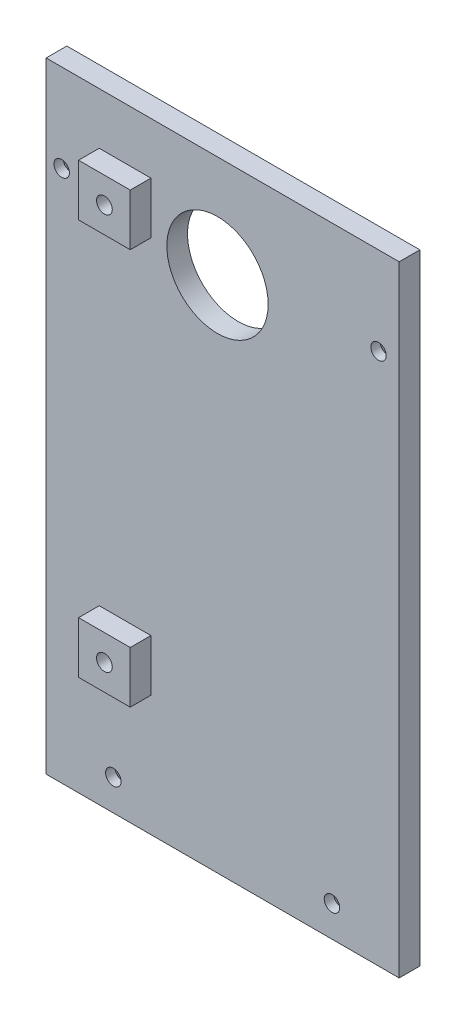
ISO-10303-21;
HEADER;
FILE_DESCRIPTION(('STEP AP214'),'2;1');
FILE_NAME('part.step','',(''),(''),'','','');
FILE_SCHEMA(('AUTOMOTIVE_DESIGN { 1 0 10303 214 1 1 1 1 }'));
ENDSEC;
DATA;
#1=APPLICATION_CONTEXT('core data for automotive mechanical design processes');
#2=APPLICATION_PROTOCOL_DEFINITION('international standard','automotive_design',2000,#1);
#3=PRODUCT_CONTEXT('',#1,'mechanical');
#4=PRODUCT('Part','Part','',(#3));
#5=PRODUCT_RELATED_PRODUCT_CATEGORY('part','',(#4));
#6=PRODUCT_DEFINITION_FORMATION('','',#4);
#7=PRODUCT_DEFINITION_CONTEXT('part definition',#1,'design');
#8=PRODUCT_DEFINITION('design','',#6,#7);
#9=PRODUCT_DEFINITION_SHAPE('','',#8);
#10=(LENGTH_UNIT() NAMED_UNIT(*) SI_UNIT(.MILLI.,.METRE.));
#11=(NAMED_UNIT(*) PLANE_ANGLE_UNIT() SI_UNIT($,.RADIAN.));
#12=(NAMED_UNIT(*) SI_UNIT($,.STERADIAN.) SOLID_ANGLE_UNIT());
#13=UNCERTAINTY_MEASURE_WITH_UNIT(LENGTH_MEASURE(1.E-05),#10,'distance_accuracy_value','');
#14=(GEOMETRIC_REPRESENTATION_CONTEXT(3) GLOBAL_UNCERTAINTY_ASSIGNED_CONTEXT((#13)) GLOBAL_UNIT_ASSIGNED_CONTEXT((#10,
#11,#12)) REPRESENTATION_CONTEXT('',''));
#15=CARTESIAN_POINT('',(0.,0.,0.));
#16=DIRECTION('',(0.,0.,1.));
#17=DIRECTION('',(1.,0.,0.));
#18=AXIS2_PLACEMENT_3D('',#15,#16,#17);
#19=CARTESIAN_POINT('',(0.,0.,2.));
#20=DIRECTION('',(0.,0.,-1.));
#21=DIRECTION('',(-1.,0.,0.));
#22=AXIS2_PLACEMENT_3D('',#19,#20,#21);
#23=PLANE('',#22);
#24=CARTESIAN_POINT('',(15.575,21.5,2.));
#25=DIRECTION('',(0.,0.,-1.));
#26=DIRECTION('',(-1.,0.,0.));
#27=AXIS2_PLACEMENT_3D('',#24,#25,#26);
#28=CIRCLE('',#27,0.75);
#29=CARTESIAN_POINT('',(14.825,21.5,2.));
#30=VERTEX_POINT('',#29);
#31=EDGE_CURVE('E180',#30,#30,#28,.F.);
#32=ORIENTED_EDGE('',*,*,#31,.F.);
#33=EDGE_LOOP('',(#32));
#34=FACE_BOUND('',#33,.T.);
#35=CARTESIAN_POINT('',(-15.075,21.5,2.));
#36=DIRECTION('',(0.,0.,-1.));
#37=DIRECTION('',(-1.,0.,0.));
#38=AXIS2_PLACEMENT_3D('',#35,#36,#37);
#39=CIRCLE('',#38,0.75);
#40=CARTESIAN_POINT('',(-15.825,21.5,2.));
#41=VERTEX_POINT('',#40);
#42=EDGE_CURVE('E184',#41,#41,#39,.F.);
#43=ORIENTED_EDGE('',*,*,#42,.F.);
#44=EDGE_LOOP('',(#43));
#45=FACE_BOUND('',#44,.T.);
#46=CARTESIAN_POINT('',(-10.075,-27.,2.));
#47=DIRECTION('',(0.,0.,-1.));
#48=DIRECTION('',(-1.,0.,0.));
#49=AXIS2_PLACEMENT_3D('',#46,#47,#48);
#50=CIRCLE('',#49,0.75);
#51=CARTESIAN_POINT('',(-10.825,-27.,2.));
#52=VERTEX_POINT('',#51);
#53=EDGE_CURVE('E187',#52,#52,#50,.F.);
#54=ORIENTED_EDGE('',*,*,#53,.F.);
#55=EDGE_LOOP('',(#54));
#56=FACE_BOUND('',#55,.T.);
#57=CARTESIAN_POINT('',(11.075,-27.,2.));
#58=DIRECTION('',(0.,0.,-1.));
#59=DIRECTION('',(-1.,0.,0.));
#60=AXIS2_PLACEMENT_3D('',#57,#58,#59);
#61=CIRCLE('',#60,0.75);
#62=CARTESIAN_POINT('',(10.325,-27.,2.));
#63=VERTEX_POINT('',#62);
#64=EDGE_CURVE('E178',#63,#63,#61,.F.);
#65=ORIENTED_EDGE('',*,*,#64,.F.);
#66=EDGE_LOOP('',(#65));
#67=FACE_BOUND('',#66,.T.);
#68=DIRECTION('',(0.,-1.,0.));
#69=VECTOR('',#68,1.);
#70=CARTESIAN_POINT('',(-11.44,25.,2.));
#71=LINE('',#70,#69);
#72=CARTESIAN_POINT('',(-11.44,25.,2.));
#73=VERTEX_POINT('',#72);
#74=CARTESIAN_POINT('',(-11.44,20.,2.));
#75=VERTEX_POINT('',#74);
#76=EDGE_CURVE('E224',#73,#75,#71,.T.);
#77=ORIENTED_EDGE('',*,*,#76,.F.);
#78=DIRECTION('',(-1.,0.,0.));
#79=VECTOR('',#78,1.);
#80=CARTESIAN_POINT('',(-11.44,25.,2.));
#81=LINE('',#80,#79);
#82=CARTESIAN_POINT('',(-6.44,25.,2.));
#83=VERTEX_POINT('',#82);
#84=EDGE_CURVE('E229',#83,#73,#81,.T.);
#85=ORIENTED_EDGE('',*,*,#84,.F.);
#86=DIRECTION('',(0.,1.,0.));
#87=VECTOR('',#86,1.);
#88=CARTESIAN_POINT('',(-6.44,25.,2.));
#89=LINE('',#88,#87);
#90=CARTESIAN_POINT('',(-6.44,20.,2.));
#91=VERTEX_POINT('',#90);
#92=EDGE_CURVE('E241',#91,#83,#89,.T.);
#93=ORIENTED_EDGE('',*,*,#92,.F.);
#94=DIRECTION('',(1.,0.,0.));
#95=VECTOR('',#94,1.);
#96=CARTESIAN_POINT('',(-11.44,20.,2.));
#97=LINE('',#96,#95);
#98=EDGE_CURVE('E238',#75,#91,#97,.T.);
#99=ORIENTED_EDGE('',*,*,#98,.F.);
#100=EDGE_LOOP('',(#77,#85,#93,#99));
#101=FACE_BOUND('',#100,.T.);
#102=DIRECTION('',(1.,0.,0.));
#103=VECTOR('',#102,1.);
#104=CARTESIAN_POINT('',(-16.575,-30.,2.));
#105=LINE('',#104,#103);
#106=CARTESIAN_POINT('',(-16.575,-30.,2.));
#107=VERTEX_POINT('',#106);
#108=CARTESIAN_POINT('',(17.575,-30.,2.));
#109=VERTEX_POINT('',#108);
#110=EDGE_CURVE('E142',#107,#109,#105,.T.);
#111=ORIENTED_EDGE('',*,*,#110,.T.);
#112=DIRECTION('',(0.,-1.,0.));
#113=VECTOR('',#112,1.);
#114=CARTESIAN_POINT('',(17.575,30.,2.));
#115=LINE('',#114,#113);
#116=CARTESIAN_POINT('',(17.575,30.,2.));
#117=VERTEX_POINT('',#116);
#118=EDGE_CURVE('E146',#117,#109,#115,.T.);
#119=ORIENTED_EDGE('',*,*,#118,.F.);
#120=DIRECTION('',(-1.,0.,0.));
#121=VECTOR('',#120,1.);
#122=CARTESIAN_POINT('',(-16.575,30.,2.));
#123=LINE('',#122,#121);
#124=CARTESIAN_POINT('',(-16.575,30.,2.));
#125=VERTEX_POINT('',#124);
#126=EDGE_CURVE('E264',#117,#125,#123,.T.);
#127=ORIENTED_EDGE('',*,*,#126,.T.);
#128=DIRECTION('',(0.,-1.,0.));
#129=VECTOR('',#128,1.);
#130=CARTESIAN_POINT('',(-16.575,-30.,2.));
#131=LINE('',#130,#129);
#132=EDGE_CURVE('E148',#125,#107,#131,.T.);
#133=ORIENTED_EDGE('',*,*,#132,.T.);
#134=EDGE_LOOP('',(#111,#119,#127,#133));
#135=FACE_BOUND('',#134,.T.);
#136=CARTESIAN_POINT('',(0.,20.1,2.));
#137=DIRECTION('',(0.,0.,1.));
#138=DIRECTION('',(1.,0.,0.));
#139=AXIS2_PLACEMENT_3D('',#136,#137,#138);
#140=CIRCLE('',#139,4.9);
#141=CARTESIAN_POINT('',(4.9,20.1,2.));
#142=VERTEX_POINT('',#141);
#143=EDGE_CURVE('E258',#142,#142,#140,.T.);
#144=ORIENTED_EDGE('',*,*,#143,.F.);
#145=EDGE_LOOP('',(#144));
#146=FACE_BOUND('',#145,.T.);
#147=DIRECTION('',(0.,-1.,0.));
#148=VECTOR('',#147,1.);
#149=CARTESIAN_POINT('',(-11.44,-18.32,2.));
#150=LINE('',#149,#148);
#151=CARTESIAN_POINT('',(-11.44,-13.32,2.));
#152=VERTEX_POINT('',#151);
#153=CARTESIAN_POINT('',(-11.44,-18.32,2.));
#154=VERTEX_POINT('',#153);
#155=EDGE_CURVE('E183',#152,#154,#150,.T.);
#156=ORIENTED_EDGE('',*,*,#155,.F.);
#157=DIRECTION('',(-1.,0.,0.));
#158=VECTOR('',#157,1.);
#159=CARTESIAN_POINT('',(-11.44,-13.32,2.));
#160=LINE('',#159,#158);
#161=CARTESIAN_POINT('',(-6.43999999999999,-13.32,2.));
#162=VERTEX_POINT('',#161);
#163=EDGE_CURVE('E196',#162,#152,#160,.T.);
#164=ORIENTED_EDGE('',*,*,#163,.F.);
#165=DIRECTION('',(0.,1.,0.));
#166=VECTOR('',#165,1.);
#167=CARTESIAN_POINT('',(-6.43999999999999,-18.32,2.));
#168=LINE('',#167,#166);
#169=CARTESIAN_POINT('',(-6.43999999999999,-18.32,2.));
#170=VERTEX_POINT('',#169);
#171=EDGE_CURVE('E208',#170,#162,#168,.T.);
#172=ORIENTED_EDGE('',*,*,#171,.F.);
#173=DIRECTION('',(1.,0.,0.));
#174=VECTOR('',#173,1.);
#175=CARTESIAN_POINT('',(-11.44,-18.32,2.));
#176=LINE('',#175,#174);
#177=EDGE_CURVE('E205',#154,#170,#176,.T.);
#178=ORIENTED_EDGE('',*,*,#177,.F.);
#179=EDGE_LOOP('',(#156,#164,#172,#178));
#180=FACE_BOUND('',#179,.T.);
#181=ADVANCED_FACE('F35',(#34,#45,#56,#67,#101,#135,#146,#180),#23,.F.);
#182=CARTESIAN_POINT('',(0.,0.,0.));
#183=DIRECTION('',(0.,0.,-1.));
#184=DIRECTION('',(-1.,0.,0.));
#185=AXIS2_PLACEMENT_3D('',#182,#183,#184);
#186=PLANE('',#185);
#187=CARTESIAN_POINT('',(15.575,21.5,0.));
#188=DIRECTION('',(0.,0.,-1.));
#189=DIRECTION('',(-1.,0.,0.));
#190=AXIS2_PLACEMENT_3D('',#187,#188,#189);
#191=CIRCLE('',#190,1.85000000000001);
#192=CARTESIAN_POINT('',(16.575,23.0564382416273,0.));
#193=VERTEX_POINT('',#192);
#194=CARTESIAN_POINT('',(16.575,19.9435617583727,0.));
#195=VERTEX_POINT('',#194);
#196=EDGE_CURVE('E279',#193,#195,#191,.F.);
#197=ORIENTED_EDGE('',*,*,#196,.T.);
#198=DIRECTION('',(0.,1.,0.));
#199=VECTOR('',#198,1.);
#200=CARTESIAN_POINT('',(16.575,30.,0.));
#201=LINE('',#200,#199);
#202=EDGE_CURVE('E168',#195,#193,#201,.T.);
#203=ORIENTED_EDGE('',*,*,#202,.T.);
#204=EDGE_LOOP('',(#197,#203));
#205=FACE_BOUND('',#204,.T.);
#206=CARTESIAN_POINT('',(-10.075,-27.,0.));
#207=DIRECTION('',(0.,0.,-1.));
#208=DIRECTION('',(-1.,0.,0.));
#209=AXIS2_PLACEMENT_3D('',#206,#207,#208);
#210=CIRCLE('',#209,1.85000000000001);
#211=CARTESIAN_POINT('',(-11.925,-27.,0.));
#212=VERTEX_POINT('',#211);
#213=EDGE_CURVE('E287',#212,#212,#210,.F.);
#214=ORIENTED_EDGE('',*,*,#213,.T.);
#215=EDGE_LOOP('',(#214));
#216=FACE_BOUND('',#215,.T.);
#217=CARTESIAN_POINT('',(11.075,-27.,0.));
#218=DIRECTION('',(0.,0.,-1.));
#219=DIRECTION('',(-1.,0.,0.));
#220=AXIS2_PLACEMENT_3D('',#217,#218,#219);
#221=CIRCLE('',#220,1.85000000000001);
#222=CARTESIAN_POINT('',(9.22499999999999,-27.,0.));
#223=VERTEX_POINT('',#222);
#224=EDGE_CURVE('E284',#223,#223,#221,.F.);
#225=ORIENTED_EDGE('',*,*,#224,.T.);
#226=EDGE_LOOP('',(#225));
#227=FACE_BOUND('',#226,.T.);
#228=DIRECTION('',(0.,-1.,0.));
#229=VECTOR('',#228,1.);
#230=CARTESIAN_POINT('',(-16.575,-30.,0.));
#231=LINE('',#230,#229);
#232=CARTESIAN_POINT('',(-16.575,20.4171796086146,0.));
#233=VERTEX_POINT('',#232);
#234=CARTESIAN_POINT('',(-16.575,-30.,0.));
#235=VERTEX_POINT('',#234);
#236=EDGE_CURVE('E268',#233,#235,#231,.T.);
#237=ORIENTED_EDGE('',*,*,#236,.F.);
#238=CARTESIAN_POINT('',(-15.075,21.5,0.));
#239=DIRECTION('',(0.,0.,-1.));
#240=DIRECTION('',(-1.,0.,0.));
#241=AXIS2_PLACEMENT_3D('',#238,#239,#240);
#242=CIRCLE('',#241,1.85000000000001);
#243=CARTESIAN_POINT('',(-16.575,22.5828203913854,0.));
#244=VERTEX_POINT('',#243);
#245=EDGE_CURVE('E282',#233,#244,#242,.F.);
#246=ORIENTED_EDGE('',*,*,#245,.T.);
#247=CARTESIAN_POINT('',(-16.575,30.,0.));
#248=VERTEX_POINT('',#247);
#249=EDGE_CURVE('E269',#248,#244,#231,.T.);
#250=ORIENTED_EDGE('',*,*,#249,.F.);
#251=DIRECTION('',(-1.,0.,0.));
#252=VECTOR('',#251,1.);
#253=CARTESIAN_POINT('',(-16.575,30.,0.));
#254=LINE('',#253,#252);
#255=CARTESIAN_POINT('',(17.575,30.,0.));
#256=VERTEX_POINT('',#255);
#257=EDGE_CURVE('E261',#256,#248,#254,.T.);
#258=ORIENTED_EDGE('',*,*,#257,.F.);
#259=DIRECTION('',(0.,1.,0.));
#260=VECTOR('',#259,1.);
#261=CARTESIAN_POINT('',(17.575,30.,0.));
#262=LINE('',#261,#260);
#263=CARTESIAN_POINT('',(17.575,-30.,0.));
#264=VERTEX_POINT('',#263);
#265=EDGE_CURVE('E162',#264,#256,#262,.T.);
#266=ORIENTED_EDGE('',*,*,#265,.F.);
#267=DIRECTION('',(1.,0.,0.));
#268=VECTOR('',#267,1.);
#269=CARTESIAN_POINT('',(-16.575,-30.,0.));
#270=LINE('',#269,#268);
#271=EDGE_CURVE('E158',#235,#264,#270,.T.);
#272=ORIENTED_EDGE('',*,*,#271,.F.);
#273=EDGE_LOOP('',(#237,#246,#250,#258,#266,#272));
#274=FACE_BOUND('',#273,.T.);
#275=CARTESIAN_POINT('',(0.,20.1,0.));
#276=DIRECTION('',(0.,0.,1.));
#277=DIRECTION('',(1.,0.,0.));
#278=AXIS2_PLACEMENT_3D('',#275,#276,#277);
#279=CIRCLE('',#278,4.9);
#280=CARTESIAN_POINT('',(4.9,20.1,0.));
#281=VERTEX_POINT('',#280);
#282=EDGE_CURVE('E257',#281,#281,#279,.T.);
#283=ORIENTED_EDGE('',*,*,#282,.T.);
#284=EDGE_LOOP('',(#283));
#285=FACE_BOUND('',#284,.T.);
#286=ADVANCED_FACE('F313',(#205,#216,#227,#274,#285),#186,.T.);
#287=CARTESIAN_POINT('',(-16.575,30.,2.));
#288=DIRECTION('',(0.,-1.,0.));
#289=DIRECTION('',(0.,0.,-1.));
#290=AXIS2_PLACEMENT_3D('',#287,#288,#289);
#291=PLANE('',#290);
#292=ORIENTED_EDGE('',*,*,#257,.T.);
#293=DIRECTION('',(0.,0.,-1.));
#294=VECTOR('',#293,1.);
#295=CARTESIAN_POINT('',(-16.575,30.,2.));
#296=LINE('',#295,#294);
#297=EDGE_CURVE('E273',#125,#248,#296,.T.);
#298=ORIENTED_EDGE('',*,*,#297,.F.);
#299=ORIENTED_EDGE('',*,*,#126,.F.);
#300=DIRECTION('',(0.,0.,1.));
#301=VECTOR('',#300,1.);
#302=CARTESIAN_POINT('',(17.575,30.,2.));
#303=LINE('',#302,#301);
#304=EDGE_CURVE('E167',#256,#117,#303,.T.);
#305=ORIENTED_EDGE('',*,*,#304,.F.);
#306=EDGE_LOOP('',(#292,#298,#299,#305));
#307=FACE_BOUND('',#306,.T.);
#308=ADVANCED_FACE('F310',(#307),#291,.F.);
#309=CARTESIAN_POINT('',(-16.575,-30.,2.));
#310=DIRECTION('',(1.,0.,0.));
#311=DIRECTION('',(0.,0.,-1.));
#312=AXIS2_PLACEMENT_3D('',#309,#310,#311);
#313=PLANE('',#312);
#314=ORIENTED_EDGE('',*,*,#249,.T.);
#315=CARTESIAN_POINT('',(-16.575,22.5828203913854,0.));
#316=CARTESIAN_POINT('',(-16.575,22.5281416650226,0.0319673621989916));
#317=CARTESIAN_POINT('',(-16.575,22.4727559943228,0.0628260284414826));
#318=CARTESIAN_POINT('',(-16.575,22.3601480105363,0.121560688128368));
#319=CARTESIAN_POINT('',(-16.575,22.3029191595878,0.149424077129607));
#320=CARTESIAN_POINT('',(-16.575,22.1857504864584,0.20152576608288));
#321=CARTESIAN_POINT('',(-16.575,22.1257825438827,0.225701896081675));
#322=CARTESIAN_POINT('',(-16.575,22.0039903824925,0.268617702606984));
#323=CARTESIAN_POINT('',(-16.575,21.9421692515657,0.287365922176134));
#324=CARTESIAN_POINT('',(-16.575,21.8356759534761,0.313487252794349));
#325=CARTESIAN_POINT('',(-16.575,21.7914274971646,0.32258558412444));
#326=CARTESIAN_POINT('',(-16.575,21.7023128502599,0.337055961570647));
#327=CARTESIAN_POINT('',(-16.575,21.6574466459128,0.342427924583363));
#328=CARTESIAN_POINT('',(-16.575,21.5677763640234,0.34912974395875));
#329=CARTESIAN_POINT('',(-16.575,21.5229747480291,0.350492114226182));
#330=CARTESIAN_POINT('',(-16.575,21.4334317764832,0.349191170640374));
#331=CARTESIAN_POINT('',(-16.575,21.3886904198304,0.346527931370149));
#332=CARTESIAN_POINT('',(-16.575,21.2997637346397,0.337338650195204));
#333=CARTESIAN_POINT('',(-16.575,21.255577042182,0.330825629192976));
#334=CARTESIAN_POINT('',(-16.575,21.1678611237851,0.314272810081807));
#335=CARTESIAN_POINT('',(-16.575,21.1243322169007,0.304231354392502));
#336=CARTESIAN_POINT('',(-16.575,20.9944303673344,0.269299023092862));
#337=CARTESIAN_POINT('',(-16.575,20.9093235681396,0.239669811064834));
#338=CARTESIAN_POINT('',(-16.575,20.7549812741565,0.176434972455351));
#339=CARTESIAN_POINT('',(-16.575,20.6852311746874,0.1440251110868));
#340=CARTESIAN_POINT('',(-16.575,20.5828790150119,0.0920844800900978));
#341=CARTESIAN_POINT('',(-16.575,20.5493544682126,0.0743444418458743));
#342=CARTESIAN_POINT('',(-16.575,20.4828639249744,0.0378756805052608));
#343=CARTESIAN_POINT('',(-16.575,20.4498977118203,0.0191473531920691));
#344=CARTESIAN_POINT('',(-16.575,20.4171796086146,0.));
#345=B_SPLINE_CURVE_WITH_KNOTS('',3,(#315,#316,#317,#318,#319,#320,#321,#322,#323,#324,#325,
#326,#327,#328,#329,#330,#331,#332,#333,#334,#335,#336,#337,#338,#339,#340,#341,#342,#343,#344),
.UNSPECIFIED.,.F.,.F.,(4,2,2,2,2,2,2,2,2,2,2,2,2,2,4),(0.,0.190076827596617,0.380924551668313,
0.57470006714594,0.76816891842928,0.90355350893934,1.03894111862438,1.17322779946078,
1.30751199238008,1.44134458144728,1.57524012633714,1.84476930960989,2.07529764327808,
2.1890692388144,2.30279561264516),.UNSPECIFIED.);
#346=EDGE_CURVE('E57',#244,#233,#345,.T.);
#347=ORIENTED_EDGE('',*,*,#346,.T.);
#348=ORIENTED_EDGE('',*,*,#236,.T.);
#349=DIRECTION('',(0.,0.,-1.));
#350=VECTOR('',#349,1.);
#351=CARTESIAN_POINT('',(-16.575,-30.,2.));
#352=LINE('',#351,#350);
#353=EDGE_CURVE('E152',#107,#235,#352,.T.);
#354=ORIENTED_EDGE('',*,*,#353,.F.);
#355=ORIENTED_EDGE('',*,*,#132,.F.);
#356=ORIENTED_EDGE('',*,*,#297,.T.);
#357=EDGE_LOOP('',(#314,#347,#348,#354,#355,#356));
#358=FACE_BOUND('',#357,.T.);
#359=ADVANCED_FACE('F305',(#358),#313,.F.);
#360=CARTESIAN_POINT('',(-16.575,-30.,2.));
#361=DIRECTION('',(0.,1.,0.));
#362=DIRECTION('',(0.,0.,1.));
#363=AXIS2_PLACEMENT_3D('',#360,#361,#362);
#364=PLANE('',#363);
#365=ORIENTED_EDGE('',*,*,#271,.T.);
#366=DIRECTION('',(0.,0.,-1.));
#367=VECTOR('',#366,1.);
#368=CARTESIAN_POINT('',(17.575,-30.,2.));
#369=LINE('',#368,#367);
#370=EDGE_CURVE('E155',#109,#264,#369,.T.);
#371=ORIENTED_EDGE('',*,*,#370,.F.);
#372=ORIENTED_EDGE('',*,*,#110,.F.);
#373=ORIENTED_EDGE('',*,*,#353,.T.);
#374=EDGE_LOOP('',(#365,#371,#372,#373));
#375=FACE_BOUND('',#374,.T.);
#376=ADVANCED_FACE('F156',(#375),#364,.F.);
#377=CARTESIAN_POINT('',(0.,20.1,2.));
#378=DIRECTION('',(0.,0.,-1.));
#379=DIRECTION('',(-1.,0.,0.));
#380=AXIS2_PLACEMENT_3D('',#377,#378,#379);
#381=CYLINDRICAL_SURFACE('',#380,4.9);
#382=ORIENTED_EDGE('',*,*,#143,.T.);
#383=EDGE_LOOP('',(#382));
#384=FACE_BOUND('',#383,.T.);
#385=ORIENTED_EDGE('',*,*,#282,.F.);
#386=EDGE_LOOP('',(#385));
#387=FACE_BOUND('',#386,.T.);
#388=ADVANCED_FACE('F345',(#384,#387),#381,.F.);
#389=CARTESIAN_POINT('',(-11.44,25.,4.));
#390=DIRECTION('',(1.,0.,0.));
#391=DIRECTION('',(0.,0.,-1.));
#392=AXIS2_PLACEMENT_3D('',#389,#390,#391);
#393=PLANE('',#392);
#394=ORIENTED_EDGE('',*,*,#76,.T.);
#395=DIRECTION('',(0.,0.,-1.));
#396=VECTOR('',#395,1.);
#397=CARTESIAN_POINT('',(-11.44,20.,4.));
#398=LINE('',#397,#396);
#399=CARTESIAN_POINT('',(-11.44,20.,4.));
#400=VERTEX_POINT('',#399);
#401=EDGE_CURVE('E254',#400,#75,#398,.T.);
#402=ORIENTED_EDGE('',*,*,#401,.F.);
#403=DIRECTION('',(0.,-1.,0.));
#404=VECTOR('',#403,1.);
#405=CARTESIAN_POINT('',(-11.44,25.,4.));
#406=LINE('',#405,#404);
#407=CARTESIAN_POINT('',(-11.44,25.,4.));
#408=VERTEX_POINT('',#407);
#409=EDGE_CURVE('E225',#408,#400,#406,.T.);
#410=ORIENTED_EDGE('',*,*,#409,.F.);
#411=DIRECTION('',(0.,0.,-1.));
#412=VECTOR('',#411,1.);
#413=CARTESIAN_POINT('',(-11.44,25.,4.));
#414=LINE('',#413,#412);
#415=EDGE_CURVE('E235',#408,#73,#414,.T.);
#416=ORIENTED_EDGE('',*,*,#415,.T.);
#417=EDGE_LOOP('',(#394,#402,#410,#416));
#418=FACE_BOUND('',#417,.T.);
#419=ADVANCED_FACE('F348',(#418),#393,.F.);
#420=CARTESIAN_POINT('',(-11.44,20.,4.));
#421=DIRECTION('',(0.,1.,0.));
#422=DIRECTION('',(0.,0.,1.));
#423=AXIS2_PLACEMENT_3D('',#420,#421,#422);
#424=PLANE('',#423);
#425=ORIENTED_EDGE('',*,*,#98,.T.);
#426=DIRECTION('',(0.,0.,-1.));
#427=VECTOR('',#426,1.);
#428=CARTESIAN_POINT('',(-6.44,20.,4.));
#429=LINE('',#428,#427);
#430=CARTESIAN_POINT('',(-6.44,20.,4.));
#431=VERTEX_POINT('',#430);
#432=EDGE_CURVE('E251',#431,#91,#429,.T.);
#433=ORIENTED_EDGE('',*,*,#432,.F.);
#434=DIRECTION('',(1.,0.,0.));
#435=VECTOR('',#434,1.);
#436=CARTESIAN_POINT('',(-11.44,20.,4.));
#437=LINE('',#436,#435);
#438=EDGE_CURVE('E228',#400,#431,#437,.T.);
#439=ORIENTED_EDGE('',*,*,#438,.F.);
#440=ORIENTED_EDGE('',*,*,#401,.T.);
#441=EDGE_LOOP('',(#425,#433,#439,#440));
#442=FACE_BOUND('',#441,.T.);
#443=ADVANCED_FACE('F352',(#442),#424,.F.);
#444=CARTESIAN_POINT('',(-6.44,25.,4.));
#445=DIRECTION('',(-1.,0.,0.));
#446=DIRECTION('',(0.,-1.,0.));
#447=AXIS2_PLACEMENT_3D('',#444,#445,#446);
#448=PLANE('',#447);
#449=ORIENTED_EDGE('',*,*,#92,.T.);
#450=DIRECTION('',(0.,0.,-1.));
#451=VECTOR('',#450,1.);
#452=CARTESIAN_POINT('',(-6.44,25.,4.));
#453=LINE('',#452,#451);
#454=CARTESIAN_POINT('',(-6.44,25.,4.));
#455=VERTEX_POINT('',#454);
#456=EDGE_CURVE('E248',#455,#83,#453,.T.);
#457=ORIENTED_EDGE('',*,*,#456,.F.);
#458=DIRECTION('',(0.,1.,0.));
#459=VECTOR('',#458,1.);
#460=CARTESIAN_POINT('',(-6.44,25.,4.));
#461=LINE('',#460,#459);
#462=EDGE_CURVE('E231',#431,#455,#461,.T.);
#463=ORIENTED_EDGE('',*,*,#462,.F.);
#464=ORIENTED_EDGE('',*,*,#432,.T.);
#465=EDGE_LOOP('',(#449,#457,#463,#464));
#466=FACE_BOUND('',#465,.T.);
#467=ADVANCED_FACE('F356',(#466),#448,.F.);
#468=CARTESIAN_POINT('',(-11.44,25.,4.));
#469=DIRECTION('',(0.,-1.,0.));
#470=DIRECTION('',(0.,0.,-1.));
#471=AXIS2_PLACEMENT_3D('',#468,#469,#470);
#472=PLANE('',#471);
#473=ORIENTED_EDGE('',*,*,#84,.T.);
#474=ORIENTED_EDGE('',*,*,#415,.F.);
#475=DIRECTION('',(-1.,0.,0.));
#476=VECTOR('',#475,1.);
#477=CARTESIAN_POINT('',(-11.44,25.,4.));
#478=LINE('',#477,#476);
#479=EDGE_CURVE('E233',#455,#408,#478,.T.);
#480=ORIENTED_EDGE('',*,*,#479,.F.);
#481=ORIENTED_EDGE('',*,*,#456,.T.);
#482=EDGE_LOOP('',(#473,#474,#480,#481));
#483=FACE_BOUND('',#482,.T.);
#484=ADVANCED_FACE('F360',(#483),#472,.F.);
#485=CARTESIAN_POINT('',(0.,0.,4.));
#486=DIRECTION('',(0.,0.,1.));
#487=DIRECTION('',(1.,0.,0.));
#488=AXIS2_PLACEMENT_3D('',#485,#486,#487);
#489=PLANE('',#488);
#490=CARTESIAN_POINT('',(-8.94,22.5,4.));
#491=DIRECTION('',(0.,0.,1.));
#492=DIRECTION('',(1.,0.,0.));
#493=AXIS2_PLACEMENT_3D('',#490,#491,#492);
#494=CIRCLE('',#493,0.762000000000001);
#495=CARTESIAN_POINT('',(-8.178,22.5,4.));
#496=VERTEX_POINT('',#495);
#497=EDGE_CURVE('E429',#496,#496,#494,.T.);
#498=ORIENTED_EDGE('',*,*,#497,.F.);
#499=EDGE_LOOP('',(#498));
#500=FACE_BOUND('',#499,.T.);
#501=ORIENTED_EDGE('',*,*,#409,.T.);
#502=ORIENTED_EDGE('',*,*,#438,.T.);
#503=ORIENTED_EDGE('',*,*,#462,.T.);
#504=ORIENTED_EDGE('',*,*,#479,.T.);
#505=EDGE_LOOP('',(#501,#502,#503,#504));
#506=FACE_BOUND('',#505,.T.);
#507=ADVANCED_FACE('F364',(#500,#506),#489,.T.);
#508=CARTESIAN_POINT('',(-11.44,-18.32,4.));
#509=DIRECTION('',(1.,0.,0.));
#510=DIRECTION('',(0.,1.,0.));
#511=AXIS2_PLACEMENT_3D('',#508,#509,#510);
#512=PLANE('',#511);
#513=ORIENTED_EDGE('',*,*,#155,.T.);
#514=DIRECTION('',(0.,0.,-1.));
#515=VECTOR('',#514,1.);
#516=CARTESIAN_POINT('',(-11.44,-18.32,4.));
#517=LINE('',#516,#515);
#518=CARTESIAN_POINT('',(-11.44,-18.32,4.));
#519=VERTEX_POINT('',#518);
#520=EDGE_CURVE('E221',#519,#154,#517,.T.);
#521=ORIENTED_EDGE('',*,*,#520,.F.);
#522=DIRECTION('',(0.,-1.,0.));
#523=VECTOR('',#522,1.);
#524=CARTESIAN_POINT('',(-11.44,-18.32,4.));
#525=LINE('',#524,#523);
#526=CARTESIAN_POINT('',(-11.44,-13.32,4.));
#527=VERTEX_POINT('',#526);
#528=EDGE_CURVE('E192',#527,#519,#525,.T.);
#529=ORIENTED_EDGE('',*,*,#528,.F.);
#530=DIRECTION('',(0.,0.,-1.));
#531=VECTOR('',#530,1.);
#532=CARTESIAN_POINT('',(-11.44,-13.32,4.));
#533=LINE('',#532,#531);
#534=EDGE_CURVE('E202',#527,#152,#533,.T.);
#535=ORIENTED_EDGE('',*,*,#534,.T.);
#536=EDGE_LOOP('',(#513,#521,#529,#535));
#537=FACE_BOUND('',#536,.T.);
#538=ADVANCED_FACE('F368',(#537),#512,.F.);
#539=CARTESIAN_POINT('',(-11.44,-18.32,4.));
#540=DIRECTION('',(0.,1.,0.));
#541=DIRECTION('',(0.,0.,1.));
#542=AXIS2_PLACEMENT_3D('',#539,#540,#541);
#543=PLANE('',#542);
#544=ORIENTED_EDGE('',*,*,#177,.T.);
#545=DIRECTION('',(0.,0.,-1.));
#546=VECTOR('',#545,1.);
#547=CARTESIAN_POINT('',(-6.43999999999999,-18.32,4.));
#548=LINE('',#547,#546);
#549=CARTESIAN_POINT('',(-6.43999999999999,-18.32,4.));
#550=VERTEX_POINT('',#549);
#551=EDGE_CURVE('E218',#550,#170,#548,.T.);
#552=ORIENTED_EDGE('',*,*,#551,.F.);
#553=DIRECTION('',(1.,0.,0.));
#554=VECTOR('',#553,1.);
#555=CARTESIAN_POINT('',(-11.44,-18.32,4.));
#556=LINE('',#555,#554);
#557=EDGE_CURVE('E195',#519,#550,#556,.T.);
#558=ORIENTED_EDGE('',*,*,#557,.F.);
#559=ORIENTED_EDGE('',*,*,#520,.T.);
#560=EDGE_LOOP('',(#544,#552,#558,#559));
#561=FACE_BOUND('',#560,.T.);
#562=ADVANCED_FACE('F372',(#561),#543,.F.);
#563=CARTESIAN_POINT('',(-6.43999999999999,-18.32,4.));
#564=DIRECTION('',(-1.,0.,0.));
#565=DIRECTION('',(0.,-1.,0.));
#566=AXIS2_PLACEMENT_3D('',#563,#564,#565);
#567=PLANE('',#566);
#568=ORIENTED_EDGE('',*,*,#171,.T.);
#569=DIRECTION('',(0.,0.,-1.));
#570=VECTOR('',#569,1.);
#571=CARTESIAN_POINT('',(-6.43999999999999,-13.32,4.));
#572=LINE('',#571,#570);
#573=CARTESIAN_POINT('',(-6.43999999999999,-13.32,4.));
#574=VERTEX_POINT('',#573);
#575=EDGE_CURVE('E215',#574,#162,#572,.T.);
#576=ORIENTED_EDGE('',*,*,#575,.F.);
#577=DIRECTION('',(0.,1.,0.));
#578=VECTOR('',#577,1.);
#579=CARTESIAN_POINT('',(-6.43999999999999,-18.32,4.));
#580=LINE('',#579,#578);
#581=EDGE_CURVE('E198',#550,#574,#580,.T.);
#582=ORIENTED_EDGE('',*,*,#581,.F.);
#583=ORIENTED_EDGE('',*,*,#551,.T.);
#584=EDGE_LOOP('',(#568,#576,#582,#583));
#585=FACE_BOUND('',#584,.T.);
#586=ADVANCED_FACE('F376',(#585),#567,.F.);
#587=CARTESIAN_POINT('',(-11.44,-13.32,4.));
#588=DIRECTION('',(0.,-1.,0.));
#589=DIRECTION('',(0.,0.,-1.));
#590=AXIS2_PLACEMENT_3D('',#587,#588,#589);
#591=PLANE('',#590);
#592=ORIENTED_EDGE('',*,*,#163,.T.);
#593=ORIENTED_EDGE('',*,*,#534,.F.);
#594=DIRECTION('',(-1.,0.,0.));
#595=VECTOR('',#594,1.);
#596=CARTESIAN_POINT('',(-11.44,-13.32,4.));
#597=LINE('',#596,#595);
#598=EDGE_CURVE('E200',#574,#527,#597,.T.);
#599=ORIENTED_EDGE('',*,*,#598,.F.);
#600=ORIENTED_EDGE('',*,*,#575,.T.);
#601=EDGE_LOOP('',(#592,#593,#599,#600));
#602=FACE_BOUND('',#601,.T.);
#603=ADVANCED_FACE('F380',(#602),#591,.F.);
#604=CARTESIAN_POINT('',(0.,0.,4.));
#605=DIRECTION('',(0.,0.,-1.));
#606=DIRECTION('',(-1.,0.,0.));
#607=AXIS2_PLACEMENT_3D('',#604,#605,#606);
#608=PLANE('',#607);
#609=CARTESIAN_POINT('',(-8.93999999999999,-15.82,4.));
#610=DIRECTION('',(0.,0.,1.));
#611=DIRECTION('',(1.,0.,0.));
#612=AXIS2_PLACEMENT_3D('',#609,#610,#611);
#613=CIRCLE('',#612,0.762000000000001);
#614=CARTESIAN_POINT('',(-8.17799999999999,-15.82,4.));
#615=VERTEX_POINT('',#614);
#616=EDGE_CURVE('E174',#615,#615,#613,.T.);
#617=ORIENTED_EDGE('',*,*,#616,.F.);
#618=EDGE_LOOP('',(#617));
#619=FACE_BOUND('',#618,.T.);
#620=ORIENTED_EDGE('',*,*,#528,.T.);
#621=ORIENTED_EDGE('',*,*,#557,.T.);
#622=ORIENTED_EDGE('',*,*,#581,.T.);
#623=ORIENTED_EDGE('',*,*,#598,.T.);
#624=EDGE_LOOP('',(#620,#621,#622,#623));
#625=FACE_BOUND('',#624,.T.);
#626=ADVANCED_FACE('F384',(#619,#625),#608,.F.);
#627=CARTESIAN_POINT('',(11.075,-27.,4.12132034355964));
#628=DIRECTION('',(0.,0.,-1.));
#629=DIRECTION('',(-1.,0.,0.));
#630=AXIS2_PLACEMENT_3D('',#627,#628,#629);
#631=CYLINDRICAL_SURFACE('',#630,0.75);
#632=CARTESIAN_POINT('',(11.075,-27.,1.10000000000001));
#633=DIRECTION('',(0.,0.,-1.));
#634=DIRECTION('',(-1.,0.,0.));
#635=AXIS2_PLACEMENT_3D('',#632,#633,#634);
#636=CIRCLE('',#635,0.75);
#637=CARTESIAN_POINT('',(10.325,-27.,1.10000000000001));
#638=VERTEX_POINT('',#637);
#639=EDGE_CURVE('E290',#638,#638,#636,.T.);
#640=ORIENTED_EDGE('',*,*,#639,.T.);
#641=EDGE_LOOP('',(#640));
#642=FACE_BOUND('',#641,.T.);
#643=ORIENTED_EDGE('',*,*,#64,.T.);
#644=EDGE_LOOP('',(#643));
#645=FACE_BOUND('',#644,.T.);
#646=ADVANCED_FACE('F388',(#642,#645),#631,.F.);
#647=CARTESIAN_POINT('',(-10.075,-27.,4.12132034355964));
#648=DIRECTION('',(0.,0.,-1.));
#649=DIRECTION('',(-1.,0.,0.));
#650=AXIS2_PLACEMENT_3D('',#647,#648,#649);
#651=CYLINDRICAL_SURFACE('',#650,0.75);
#652=CARTESIAN_POINT('',(-10.075,-27.,1.10000000000001));
#653=DIRECTION('',(0.,0.,-1.));
#654=DIRECTION('',(-1.,0.,0.));
#655=AXIS2_PLACEMENT_3D('',#652,#653,#654);
#656=CIRCLE('',#655,0.75);
#657=CARTESIAN_POINT('',(-10.825,-27.,1.10000000000001));
#658=VERTEX_POINT('',#657);
#659=EDGE_CURVE('E276',#658,#658,#656,.T.);
#660=ORIENTED_EDGE('',*,*,#659,.T.);
#661=EDGE_LOOP('',(#660));
#662=FACE_BOUND('',#661,.T.);
#663=ORIENTED_EDGE('',*,*,#53,.T.);
#664=EDGE_LOOP('',(#663));
#665=FACE_BOUND('',#664,.T.);
#666=ADVANCED_FACE('F392',(#662,#665),#651,.F.);
#667=CARTESIAN_POINT('',(-15.075,21.5,4.12132034355964));
#668=DIRECTION('',(0.,0.,-1.));
#669=DIRECTION('',(-1.,0.,0.));
#670=AXIS2_PLACEMENT_3D('',#667,#668,#669);
#671=CYLINDRICAL_SURFACE('',#670,0.75);
#672=CARTESIAN_POINT('',(-15.075,21.5,1.10000000000002));
#673=DIRECTION('',(0.,0.,-1.));
#674=DIRECTION('',(-1.,0.,0.));
#675=AXIS2_PLACEMENT_3D('',#672,#673,#674);
#676=CIRCLE('',#675,0.75);
#677=CARTESIAN_POINT('',(-15.825,21.5,1.10000000000002));
#678=VERTEX_POINT('',#677);
#679=EDGE_CURVE('E293',#678,#678,#676,.T.);
#680=ORIENTED_EDGE('',*,*,#679,.T.);
#681=EDGE_LOOP('',(#680));
#682=FACE_BOUND('',#681,.T.);
#683=ORIENTED_EDGE('',*,*,#42,.T.);
#684=EDGE_LOOP('',(#683));
#685=FACE_BOUND('',#684,.T.);
#686=ADVANCED_FACE('F396',(#682,#685),#671,.F.);
#687=CARTESIAN_POINT('',(15.575,21.5,4.12132034355964));
#688=DIRECTION('',(0.,0.,-1.));
#689=DIRECTION('',(-1.,0.,0.));
#690=AXIS2_PLACEMENT_3D('',#687,#688,#689);
#691=CYLINDRICAL_SURFACE('',#690,0.75);
#692=CARTESIAN_POINT('',(15.575,21.5,1.10000000000002));
#693=DIRECTION('',(0.,0.,-1.));
#694=DIRECTION('',(-1.,0.,0.));
#695=AXIS2_PLACEMENT_3D('',#692,#693,#694);
#696=CIRCLE('',#695,0.75);
#697=CARTESIAN_POINT('',(14.825,21.5,1.10000000000002));
#698=VERTEX_POINT('',#697);
#699=EDGE_CURVE('E50',#698,#698,#696,.T.);
#700=ORIENTED_EDGE('',*,*,#699,.T.);
#701=EDGE_LOOP('',(#700));
#702=FACE_BOUND('',#701,.T.);
#703=ORIENTED_EDGE('',*,*,#31,.T.);
#704=EDGE_LOOP('',(#703));
#705=FACE_BOUND('',#704,.T.);
#706=ADVANCED_FACE('F324',(#702,#705),#691,.F.);
#707=CARTESIAN_POINT('',(-10.075,-27.,1.10000000000001));
#708=DIRECTION('',(0.,0.,-1.));
#709=DIRECTION('',(-1.,0.,0.));
#710=AXIS2_PLACEMENT_3D('',#707,#708,#709);
#711=CONICAL_SURFACE('',#710,0.75,0.785398163397447);
#712=ORIENTED_EDGE('',*,*,#213,.F.);
#713=EDGE_LOOP('',(#712));
#714=FACE_BOUND('',#713,.T.);
#715=ORIENTED_EDGE('',*,*,#659,.F.);
#716=EDGE_LOOP('',(#715));
#717=FACE_BOUND('',#716,.T.);
#718=ADVANCED_FACE('F318',(#714,#717),#711,.F.);
#719=CARTESIAN_POINT('',(11.075,-27.,1.10000000000001));
#720=DIRECTION('',(0.,0.,-1.));
#721=DIRECTION('',(-1.,0.,0.));
#722=AXIS2_PLACEMENT_3D('',#719,#720,#721);
#723=CONICAL_SURFACE('',#722,0.75,0.785398163397447);
#724=ORIENTED_EDGE('',*,*,#224,.F.);
#725=EDGE_LOOP('',(#724));
#726=FACE_BOUND('',#725,.T.);
#727=ORIENTED_EDGE('',*,*,#639,.F.);
#728=EDGE_LOOP('',(#727));
#729=FACE_BOUND('',#728,.T.);
#730=ADVANCED_FACE('F323',(#726,#729),#723,.F.);
#731=CARTESIAN_POINT('',(-15.075,21.5,1.10000000000002));
#732=DIRECTION('',(0.,0.,-1.));
#733=DIRECTION('',(-1.,0.,0.));
#734=AXIS2_PLACEMENT_3D('',#731,#732,#733);
#735=CONICAL_SURFACE('',#734,0.75,0.785398163397444);
#736=ORIENTED_EDGE('',*,*,#346,.F.);
#737=ORIENTED_EDGE('',*,*,#245,.F.);
#738=EDGE_LOOP('',(#736,#737));
#739=FACE_BOUND('',#738,.T.);
#740=ORIENTED_EDGE('',*,*,#679,.F.);
#741=EDGE_LOOP('',(#740));
#742=FACE_BOUND('',#741,.T.);
#743=ADVANCED_FACE('F302',(#739,#742),#735,.F.);
#744=CARTESIAN_POINT('',(15.575,21.5,1.10000000000002));
#745=DIRECTION('',(0.,0.,-1.));
#746=DIRECTION('',(-1.,0.,0.));
#747=AXIS2_PLACEMENT_3D('',#744,#745,#746);
#748=CONICAL_SURFACE('',#747,0.75,0.785398163397443);
#749=CARTESIAN_POINT('',(16.575,19.9435617583727,0.));
#750=CARTESIAN_POINT('',(16.575,19.9922143263084,0.0409113986544775));
#751=CARTESIAN_POINT('',(16.575,20.0411265847688,0.0815204568742537));
#752=CARTESIAN_POINT('',(16.575,20.1396780691776,0.161911540214793));
#753=CARTESIAN_POINT('',(16.575,20.189317748113,0.201693009116265));
#754=CARTESIAN_POINT('',(16.575,20.291571250857,0.281799751992241));
#755=CARTESIAN_POINT('',(16.575,20.3442224392463,0.322077726123811));
#756=CARTESIAN_POINT('',(16.575,20.450729596614,0.400971396733111));
#757=CARTESIAN_POINT('',(16.575,20.5045852160853,0.439587566168277));
#758=CARTESIAN_POINT('',(16.575,20.6141136980223,0.51463499047945));
#759=CARTESIAN_POINT('',(16.575,20.6697919670523,0.551058621031764));
#760=CARTESIAN_POINT('',(16.575,20.7832225420626,0.620470681283211));
#761=CARTESIAN_POINT('',(16.575,20.8409769402392,0.653455507189497));
#762=CARTESIAN_POINT('',(16.575,21.0164506420767,0.74369744503423));
#763=CARTESIAN_POINT('',(16.575,21.1386086708418,0.793933011954724));
#764=CARTESIAN_POINT('',(16.575,21.297673348052,0.830210552502962));
#765=CARTESIAN_POINT('',(16.575,21.3299667894723,0.836158582248483));
#766=CARTESIAN_POINT('',(16.575,21.3949719600302,0.845015350093333));
#767=CARTESIAN_POINT('',(16.575,21.4276836483427,0.847924382571002));
#768=CARTESIAN_POINT('',(16.575,21.4931822356608,0.850510679624554));
#769=CARTESIAN_POINT('',(16.575,21.5259689087782,0.850193489971764));
#770=CARTESIAN_POINT('',(16.575,21.5913484699414,0.846368623132673));
#771=CARTESIAN_POINT('',(16.575,21.6239413393797,0.842860644414367));
#772=CARTESIAN_POINT('',(16.575,21.7201763265838,0.827985287623342));
#773=CARTESIAN_POINT('',(16.575,21.7831761804093,0.812291928705464));
#774=CARTESIAN_POINT('',(16.575,21.8757446015099,0.782149040471723));
#775=CARTESIAN_POINT('',(16.575,21.9064608425005,0.770911412242132));
#776=CARTESIAN_POINT('',(16.575,21.9671623022611,0.746608944277349));
#777=CARTESIAN_POINT('',(16.575,21.9971476691561,0.733544478461507));
#778=CARTESIAN_POINT('',(16.575,22.0760089369872,0.696795086642655));
#779=CARTESIAN_POINT('',(16.575,22.1242689980649,0.671798575419847));
#780=CARTESIAN_POINT('',(16.575,22.2191712346946,0.618879598824851));
#781=CARTESIAN_POINT('',(16.575,22.2658122095516,0.590955021232108));
#782=CARTESIAN_POINT('',(16.575,22.3579294114511,0.532897305414197));
#783=CARTESIAN_POINT('',(16.575,22.4034006903817,0.502756377762082));
#784=CARTESIAN_POINT('',(16.575,22.4932716726418,0.440911629618493));
#785=CARTESIAN_POINT('',(16.575,22.5376711727352,0.409207516122042));
#786=CARTESIAN_POINT('',(16.575,22.6634742826505,0.316845871687754));
#787=CARTESIAN_POINT('',(16.575,22.7438273304283,0.254760305846942));
#788=CARTESIAN_POINT('',(16.575,22.8625001777306,0.160071242458544));
#789=CARTESIAN_POINT('',(16.575,22.9015746634335,0.128395743731371));
#790=CARTESIAN_POINT('',(16.575,22.9793014941949,0.0645474511459242));
#791=CARTESIAN_POINT('',(16.575,23.017953928197,0.0323747656571146));
#792=CARTESIAN_POINT('',(16.575,23.0564382416273,0.));
#793=B_SPLINE_CURVE_WITH_KNOTS('',3,(#749,#750,#751,#752,#753,#754,#755,#756,#757,#758,#759,
#760,#761,#762,#763,#764,#765,#766,#767,#768,#769,#770,#771,#772,#773,#774,#775,#776,#777,#778,
#779,#780,#781,#782,#783,#784,#785,#786,#787,#788,#789,#790,#791,#792),.UNSPECIFIED.,.F.,.F.,(4,
2,2,2,2,2,2,2,2,2,2,2,2,2,2,2,2,2,2,2,2,4),(0.,0.190706675476948,0.381537633330765,
0.580381113643671,0.77916762275272,0.978609603874979,1.17825853816861,1.56918196916919,
1.6675610760976,1.76593065245987,1.86413116332387,1.96234095517541,2.15609846247857,
2.25418585300986,2.35225319620173,2.51514894321533,2.67816301753293,2.84178024718874,
3.00542826287007,3.30996402272474,3.46086453569793,3.61173260895588),.UNSPECIFIED.);
#794=EDGE_CURVE('E11',#195,#193,#793,.T.);
#795=ORIENTED_EDGE('',*,*,#794,.F.);
#796=ORIENTED_EDGE('',*,*,#196,.F.);
#797=EDGE_LOOP('',(#795,#796));
#798=FACE_BOUND('',#797,.T.);
#799=ORIENTED_EDGE('',*,*,#699,.F.);
#800=EDGE_LOOP('',(#799));
#801=FACE_BOUND('',#800,.T.);
#802=ADVANCED_FACE('F38',(#798,#801),#748,.F.);
#803=CARTESIAN_POINT('',(17.575,0.,0.));
#804=DIRECTION('',(1.,0.,0.));
#805=DIRECTION('',(0.,0.,-1.));
#806=AXIS2_PLACEMENT_3D('',#803,#804,#805);
#807=PLANE('',#806);
#808=ORIENTED_EDGE('',*,*,#118,.T.);
#809=ORIENTED_EDGE('',*,*,#370,.T.);
#810=ORIENTED_EDGE('',*,*,#265,.T.);
#811=ORIENTED_EDGE('',*,*,#304,.T.);
#812=EDGE_LOOP('',(#808,#809,#810,#811));
#813=FACE_BOUND('',#812,.T.);
#814=ADVANCED_FACE('F165',(#813),#807,.T.);
#815=CARTESIAN_POINT('',(16.575,0.,0.));
#816=DIRECTION('',(1.,0.,0.));
#817=DIRECTION('',(0.,0.,-1.));
#818=AXIS2_PLACEMENT_3D('',#815,#816,#817);
#819=PLANE('',#818);
#820=ORIENTED_EDGE('',*,*,#794,.T.);
#821=ORIENTED_EDGE('',*,*,#202,.F.);
#822=EDGE_LOOP('',(#820,#821));
#823=FACE_BOUND('',#822,.T.);
#824=ADVANCED_FACE('F404',(#823),#819,.F.);
#825=CARTESIAN_POINT('',(-8.93999999999999,-15.82,0.5));
#826=DIRECTION('',(0.,0.,1.));
#827=DIRECTION('',(1.,0.,0.));
#828=AXIS2_PLACEMENT_3D('',#825,#826,#827);
#829=CYLINDRICAL_SURFACE('',#828,0.762000000000001);
#830=CARTESIAN_POINT('',(-8.93999999999999,-15.82,0.5));
#831=DIRECTION('',(0.,0.,1.));
#832=DIRECTION('',(1.,0.,0.));
#833=AXIS2_PLACEMENT_3D('',#830,#831,#832);
#834=CIRCLE('',#833,0.762000000000001);
#835=CARTESIAN_POINT('',(-8.17799999999999,-15.82,0.5));
#836=VERTEX_POINT('',#835);
#837=EDGE_CURVE('E432',#836,#836,#834,.T.);
#838=ORIENTED_EDGE('',*,*,#837,.F.);
#839=EDGE_LOOP('',(#838));
#840=FACE_BOUND('',#839,.T.);
#841=ORIENTED_EDGE('',*,*,#616,.T.);
#842=EDGE_LOOP('',(#841));
#843=FACE_BOUND('',#842,.T.);
#844=ADVANCED_FACE('F407',(#840,#843),#829,.F.);
#845=CARTESIAN_POINT('',(-8.93999999999999,-15.82,0.5));
#846=DIRECTION('',(0.,0.,1.));
#847=DIRECTION('',(1.,0.,0.));
#848=AXIS2_PLACEMENT_3D('',#845,#846,#847);
#849=PLANE('',#848);
#850=ORIENTED_EDGE('',*,*,#837,.T.);
#851=EDGE_LOOP('',(#850));
#852=FACE_BOUND('',#851,.T.);
#853=ADVANCED_FACE('F413',(#852),#849,.T.);
#854=CARTESIAN_POINT('',(-8.94,22.5,0.5));
#855=DIRECTION('',(0.,0.,1.));
#856=DIRECTION('',(1.,0.,0.));
#857=AXIS2_PLACEMENT_3D('',#854,#855,#856);
#858=CYLINDRICAL_SURFACE('',#857,0.762000000000001);
#859=CARTESIAN_POINT('',(-8.94,22.5,0.5));
#860=DIRECTION('',(0.,0.,1.));
#861=DIRECTION('',(1.,0.,0.));
#862=AXIS2_PLACEMENT_3D('',#859,#860,#861);
#863=CIRCLE('',#862,0.762000000000001);
#864=CARTESIAN_POINT('',(-8.178,22.5,0.5));
#865=VERTEX_POINT('',#864);
#866=EDGE_CURVE('E171',#865,#865,#863,.T.);
#867=ORIENTED_EDGE('',*,*,#866,.F.);
#868=EDGE_LOOP('',(#867));
#869=FACE_BOUND('',#868,.T.);
#870=ORIENTED_EDGE('',*,*,#497,.T.);
#871=EDGE_LOOP('',(#870));
#872=FACE_BOUND('',#871,.T.);
#873=ADVANCED_FACE('F417',(#869,#872),#858,.F.);
#874=CARTESIAN_POINT('',(-8.94,22.5,0.5));
#875=DIRECTION('',(0.,0.,1.));
#876=DIRECTION('',(1.,0.,0.));
#877=AXIS2_PLACEMENT_3D('',#874,#875,#876);
#878=PLANE('',#877);
#879=ORIENTED_EDGE('',*,*,#866,.T.);
#880=EDGE_LOOP('',(#879));
#881=FACE_BOUND('',#880,.T.);
#882=ADVANCED_FACE('F421',(#881),#878,.T.);
#883=CLOSED_SHELL('',(#181,#286,#308,#359,#376,#388,#419,#443,#467,#484,#507,#538,#562,#586,
#603,#626,#646,#666,#686,#706,#718,#730,#743,#802,#814,#824,#844,#853,#873,#882));
#884=MANIFOLD_SOLID_BREP('B2',#883);
#885=ADVANCED_BREP_SHAPE_REPRESENTATION('',(#18,#884),#14);
#886=SHAPE_DEFINITION_REPRESENTATION(#9,#885);
ENDSEC;
END-ISO-10303-21;
